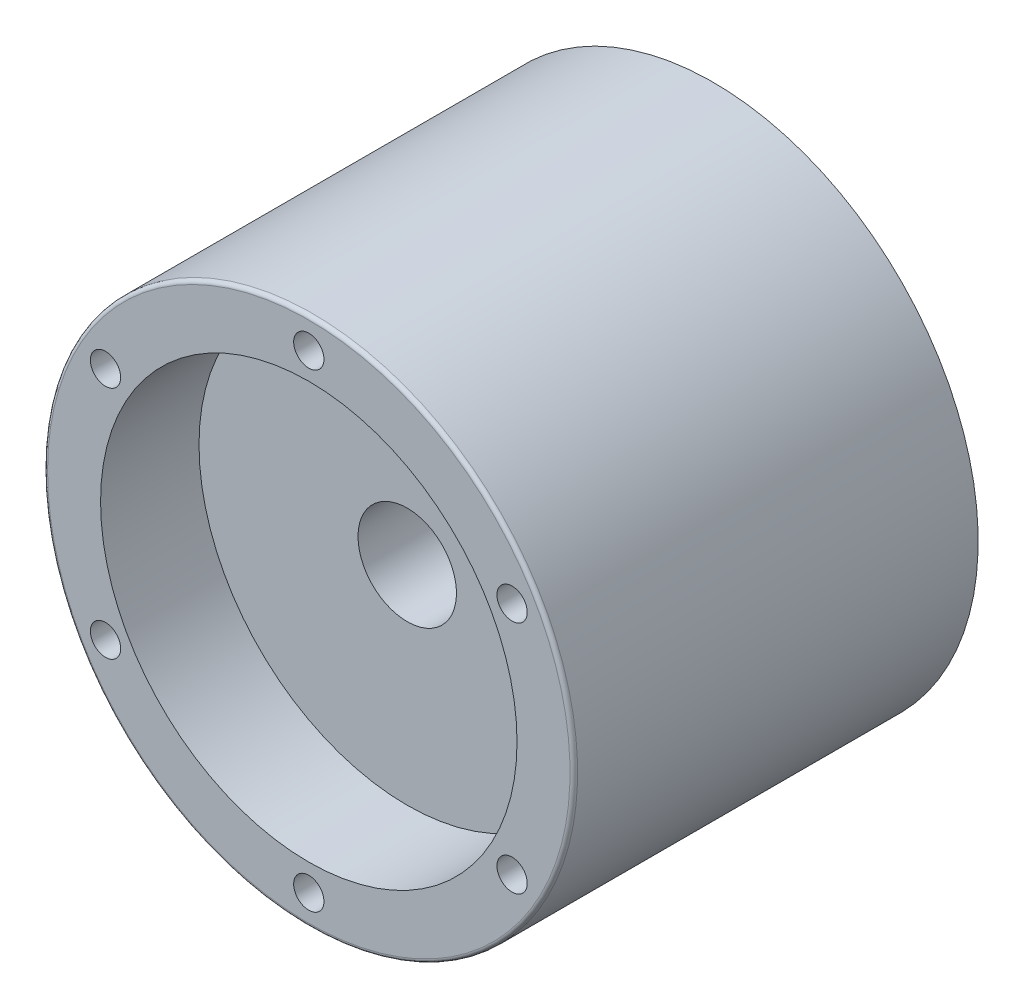
ISO-10303-21;
HEADER;
FILE_DESCRIPTION(('STEP AP214'),'2;1');
FILE_NAME('part.step','',(''),(''),'','','');
FILE_SCHEMA(('AUTOMOTIVE_DESIGN { 1 0 10303 214 1 1 1 1 }'));
ENDSEC;
DATA;
#1=APPLICATION_CONTEXT('core data for automotive mechanical design processes');
#2=APPLICATION_PROTOCOL_DEFINITION('international standard','automotive_design',2000,#1);
#3=PRODUCT_CONTEXT('',#1,'mechanical');
#4=PRODUCT('Part','Part','',(#3));
#5=PRODUCT_RELATED_PRODUCT_CATEGORY('part','',(#4));
#6=PRODUCT_DEFINITION_FORMATION('','',#4);
#7=PRODUCT_DEFINITION_CONTEXT('part definition',#1,'design');
#8=PRODUCT_DEFINITION('design','',#6,#7);
#9=PRODUCT_DEFINITION_SHAPE('','',#8);
#10=(LENGTH_UNIT() NAMED_UNIT(*) SI_UNIT(.MILLI.,.METRE.));
#11=(NAMED_UNIT(*) PLANE_ANGLE_UNIT() SI_UNIT($,.RADIAN.));
#12=(NAMED_UNIT(*) SI_UNIT($,.STERADIAN.) SOLID_ANGLE_UNIT());
#13=UNCERTAINTY_MEASURE_WITH_UNIT(LENGTH_MEASURE(1.E-05),#10,'distance_accuracy_value','');
#14=(GEOMETRIC_REPRESENTATION_CONTEXT(3) GLOBAL_UNCERTAINTY_ASSIGNED_CONTEXT((#13)) GLOBAL_UNIT_ASSIGNED_CONTEXT((#10,
#11,#12)) REPRESENTATION_CONTEXT('',''));
#15=CARTESIAN_POINT('',(0.,0.,0.));
#16=DIRECTION('',(0.,0.,1.));
#17=DIRECTION('',(1.,0.,0.));
#18=AXIS2_PLACEMENT_3D('',#15,#16,#17);
#19=CARTESIAN_POINT('',(0.,0.,0.));
#20=DIRECTION('',(0.,0.,1.));
#21=DIRECTION('',(1.,0.,0.));
#22=AXIS2_PLACEMENT_3D('',#19,#20,#21);
#23=PLANE('',#22);
#24=CARTESIAN_POINT('',(0.,0.,0.));
#25=DIRECTION('',(0.,0.,1.));
#26=DIRECTION('',(1.,0.,0.));
#27=AXIS2_PLACEMENT_3D('',#24,#25,#26);
#28=CIRCLE('',#27,6.5);
#29=CARTESIAN_POINT('',(-6.5,0.,0.));
#30=VERTEX_POINT('',#29);
#31=EDGE_CURVE('E136',#30,#30,#28,.T.);
#32=ORIENTED_EDGE('',*,*,#31,.T.);
#33=EDGE_LOOP('',(#32));
#34=FACE_BOUND('',#33,.T.);
#35=CARTESIAN_POINT('',(0.,0.,0.));
#36=DIRECTION('',(0.,0.,1.));
#37=DIRECTION('',(1.,0.,0.));
#38=AXIS2_PLACEMENT_3D('',#35,#36,#37);
#39=CIRCLE('',#38,35.);
#40=CARTESIAN_POINT('',(-35.,0.,0.));
#41=VERTEX_POINT('',#40);
#42=EDGE_CURVE('E167',#41,#41,#39,.T.);
#43=ORIENTED_EDGE('',*,*,#42,.F.);
#44=EDGE_LOOP('',(#43));
#45=FACE_BOUND('',#44,.T.);
#46=ADVANCED_FACE('F16',(#34,#45),#23,.F.);
#47=CARTESIAN_POINT('',(0.,0.,40.4));
#48=DIRECTION('',(0.,0.,1.));
#49=DIRECTION('',(1.,0.,0.));
#50=AXIS2_PLACEMENT_3D('',#47,#48,#49);
#51=PLANE('',#50);
#52=CARTESIAN_POINT('',(0.,0.,40.4));
#53=DIRECTION('',(0.,0.,-1.));
#54=DIRECTION('',(1.,0.,0.));
#55=AXIS2_PLACEMENT_3D('',#52,#53,#54);
#56=CIRCLE('',#55,6.5);
#57=CARTESIAN_POINT('',(-6.5,0.,40.4));
#58=VERTEX_POINT('',#57);
#59=EDGE_CURVE('E149',#58,#58,#56,.T.);
#60=ORIENTED_EDGE('',*,*,#59,.T.);
#61=EDGE_LOOP('',(#60));
#62=FACE_BOUND('',#61,.T.);
#63=CARTESIAN_POINT('',(0.,0.,40.4));
#64=DIRECTION('',(0.,0.,-1.));
#65=DIRECTION('',(1.,0.,0.));
#66=AXIS2_PLACEMENT_3D('',#63,#64,#65);
#67=CIRCLE('',#66,27.5);
#68=CARTESIAN_POINT('',(-27.5,0.,40.4));
#69=VERTEX_POINT('',#68);
#70=EDGE_CURVE('E11',#69,#69,#67,.T.);
#71=ORIENTED_EDGE('',*,*,#70,.F.);
#72=EDGE_LOOP('',(#71));
#73=FACE_BOUND('',#72,.T.);
#74=ADVANCED_FACE('F259',(#62,#73),#51,.T.);
#75=CARTESIAN_POINT('',(0.,0.,53.4));
#76=DIRECTION('',(0.,0.,-1.));
#77=DIRECTION('',(1.,0.,0.));
#78=AXIS2_PLACEMENT_3D('',#75,#76,#77);
#79=CYLINDRICAL_SURFACE('',#78,27.5);
#80=CARTESIAN_POINT('',(0.,0.,53.4));
#81=DIRECTION('',(0.,0.,-1.));
#82=DIRECTION('',(1.,0.,0.));
#83=AXIS2_PLACEMENT_3D('',#80,#81,#82);
#84=CIRCLE('',#83,27.5);
#85=CARTESIAN_POINT('',(-27.5,0.,53.4));
#86=VERTEX_POINT('',#85);
#87=EDGE_CURVE('E162',#86,#86,#84,.T.);
#88=ORIENTED_EDGE('',*,*,#87,.F.);
#89=DIRECTION('',(0.,0.,-1.));
#90=VECTOR('',#89,1.);
#91=CARTESIAN_POINT('',(-27.5,0.,53.4));
#92=LINE('',#91,#90);
#93=EDGE_CURVE('E27',#86,#69,#92,.T.);
#94=ORIENTED_EDGE('',*,*,#93,.T.);
#95=ORIENTED_EDGE('',*,*,#70,.T.);
#96=ORIENTED_EDGE('',*,*,#93,.F.);
#97=EDGE_LOOP('',(#88,#94,#95,#96));
#98=FACE_BOUND('',#97,.T.);
#99=ADVANCED_FACE('F266',(#98),#79,.F.);
#100=CARTESIAN_POINT('',(0.,31.,33.4));
#101=DIRECTION('',(0.,0.,1.));
#102=DIRECTION('',(1.,0.,0.));
#103=AXIS2_PLACEMENT_3D('',#100,#101,#102);
#104=PLANE('',#103);
#105=CARTESIAN_POINT('',(0.,31.,33.4));
#106=DIRECTION('',(0.,0.,-1.));
#107=DIRECTION('',(1.,0.,0.));
#108=AXIS2_PLACEMENT_3D('',#105,#106,#107);
#109=CIRCLE('',#108,2.);
#110=CARTESIAN_POINT('',(-2.,31.,33.4));
#111=VERTEX_POINT('',#110);
#112=EDGE_CURVE('E182',#111,#111,#109,.T.);
#113=ORIENTED_EDGE('',*,*,#112,.F.);
#114=EDGE_LOOP('',(#113));
#115=FACE_BOUND('',#114,.T.);
#116=ADVANCED_FACE('F280',(#115),#104,.T.);
#117=CARTESIAN_POINT('',(0.,31.,53.4));
#118=DIRECTION('',(0.,0.,-1.));
#119=DIRECTION('',(1.,0.,0.));
#120=AXIS2_PLACEMENT_3D('',#117,#118,#119);
#121=CYLINDRICAL_SURFACE('',#120,2.);
#122=CARTESIAN_POINT('',(0.,31.,53.4));
#123=DIRECTION('',(0.,0.,-1.));
#124=DIRECTION('',(1.,0.,0.));
#125=AXIS2_PLACEMENT_3D('',#122,#123,#124);
#126=CIRCLE('',#125,2.);
#127=CARTESIAN_POINT('',(-2.,31.,53.4));
#128=VERTEX_POINT('',#127);
#129=EDGE_CURVE('E166',#128,#128,#126,.T.);
#130=ORIENTED_EDGE('',*,*,#129,.F.);
#131=DIRECTION('',(0.,0.,-1.));
#132=VECTOR('',#131,1.);
#133=CARTESIAN_POINT('',(-2.,31.,53.4));
#134=LINE('',#133,#132);
#135=EDGE_CURVE('E143',#128,#111,#134,.T.);
#136=ORIENTED_EDGE('',*,*,#135,.T.);
#137=ORIENTED_EDGE('',*,*,#112,.T.);
#138=ORIENTED_EDGE('',*,*,#135,.F.);
#139=EDGE_LOOP('',(#130,#136,#137,#138));
#140=FACE_BOUND('',#139,.T.);
#141=ADVANCED_FACE('F285',(#140),#121,.F.);
#142=CARTESIAN_POINT('',(-26.8467875173176,-15.5,33.4));
#143=DIRECTION('',(0.,0.,1.));
#144=DIRECTION('',(1.,0.,0.));
#145=AXIS2_PLACEMENT_3D('',#142,#143,#144);
#146=PLANE('',#145);
#147=CARTESIAN_POINT('',(-26.8467875173176,-15.5,33.4));
#148=DIRECTION('',(0.,0.,-1.));
#149=DIRECTION('',(1.,0.,0.));
#150=AXIS2_PLACEMENT_3D('',#147,#148,#149);
#151=CIRCLE('',#150,2.);
#152=CARTESIAN_POINT('',(-28.8467875173176,-15.5,33.4));
#153=VERTEX_POINT('',#152);
#154=EDGE_CURVE('E141',#153,#153,#151,.T.);
#155=ORIENTED_EDGE('',*,*,#154,.F.);
#156=EDGE_LOOP('',(#155));
#157=FACE_BOUND('',#156,.T.);
#158=ADVANCED_FACE('F317',(#157),#146,.T.);
#159=CARTESIAN_POINT('',(-26.8467875173176,-15.5,53.4));
#160=DIRECTION('',(0.,0.,-1.));
#161=DIRECTION('',(1.,0.,0.));
#162=AXIS2_PLACEMENT_3D('',#159,#160,#161);
#163=CYLINDRICAL_SURFACE('',#162,2.);
#164=CARTESIAN_POINT('',(-26.8467875173176,-15.5,53.4));
#165=DIRECTION('',(0.,0.,-1.));
#166=DIRECTION('',(1.,0.,0.));
#167=AXIS2_PLACEMENT_3D('',#164,#165,#166);
#168=CIRCLE('',#167,2.);
#169=CARTESIAN_POINT('',(-28.8467875173176,-15.5,53.4));
#170=VERTEX_POINT('',#169);
#171=EDGE_CURVE('E206',#170,#170,#168,.T.);
#172=ORIENTED_EDGE('',*,*,#171,.F.);
#173=DIRECTION('',(0.,0.,-1.));
#174=VECTOR('',#173,1.);
#175=CARTESIAN_POINT('',(-28.8467875173176,-15.5,53.4));
#176=LINE('',#175,#174);
#177=EDGE_CURVE('E139',#170,#153,#176,.T.);
#178=ORIENTED_EDGE('',*,*,#177,.T.);
#179=ORIENTED_EDGE('',*,*,#154,.T.);
#180=ORIENTED_EDGE('',*,*,#177,.F.);
#181=EDGE_LOOP('',(#172,#178,#179,#180));
#182=FACE_BOUND('',#181,.T.);
#183=ADVANCED_FACE('F18',(#182),#163,.F.);
#184=CARTESIAN_POINT('',(0.,-31.,33.4));
#185=DIRECTION('',(0.,0.,1.));
#186=DIRECTION('',(1.,0.,0.));
#187=AXIS2_PLACEMENT_3D('',#184,#185,#186);
#188=PLANE('',#187);
#189=CARTESIAN_POINT('',(0.,-31.,33.4));
#190=DIRECTION('',(0.,0.,-1.));
#191=DIRECTION('',(1.,0.,0.));
#192=AXIS2_PLACEMENT_3D('',#189,#190,#191);
#193=CIRCLE('',#192,2.);
#194=CARTESIAN_POINT('',(-2.,-31.,33.4));
#195=VERTEX_POINT('',#194);
#196=EDGE_CURVE('E214',#195,#195,#193,.T.);
#197=ORIENTED_EDGE('',*,*,#196,.F.);
#198=EDGE_LOOP('',(#197));
#199=FACE_BOUND('',#198,.T.);
#200=ADVANCED_FACE('F254',(#199),#188,.T.);
#201=CARTESIAN_POINT('',(0.,-31.,53.4));
#202=DIRECTION('',(0.,0.,-1.));
#203=DIRECTION('',(1.,0.,0.));
#204=AXIS2_PLACEMENT_3D('',#201,#202,#203);
#205=CYLINDRICAL_SURFACE('',#204,2.);
#206=CARTESIAN_POINT('',(0.,-31.,53.4));
#207=DIRECTION('',(0.,0.,-1.));
#208=DIRECTION('',(1.,0.,0.));
#209=AXIS2_PLACEMENT_3D('',#206,#207,#208);
#210=CIRCLE('',#209,2.);
#211=CARTESIAN_POINT('',(-2.,-31.,53.4));
#212=VERTEX_POINT('',#211);
#213=EDGE_CURVE('E209',#212,#212,#210,.T.);
#214=ORIENTED_EDGE('',*,*,#213,.F.);
#215=DIRECTION('',(0.,0.,-1.));
#216=VECTOR('',#215,1.);
#217=CARTESIAN_POINT('',(-2.,-31.,53.4));
#218=LINE('',#217,#216);
#219=EDGE_CURVE('E210',#212,#195,#218,.T.);
#220=ORIENTED_EDGE('',*,*,#219,.T.);
#221=ORIENTED_EDGE('',*,*,#196,.T.);
#222=ORIENTED_EDGE('',*,*,#219,.F.);
#223=EDGE_LOOP('',(#214,#220,#221,#222));
#224=FACE_BOUND('',#223,.T.);
#225=ADVANCED_FACE('F226',(#224),#205,.F.);
#226=CARTESIAN_POINT('',(26.8467875173176,15.5,33.4));
#227=DIRECTION('',(0.,0.,1.));
#228=DIRECTION('',(1.,0.,0.));
#229=AXIS2_PLACEMENT_3D('',#226,#227,#228);
#230=PLANE('',#229);
#231=CARTESIAN_POINT('',(26.8467875173176,15.5,33.4));
#232=DIRECTION('',(0.,0.,-1.));
#233=DIRECTION('',(1.,0.,0.));
#234=AXIS2_PLACEMENT_3D('',#231,#232,#233);
#235=CIRCLE('',#234,2.);
#236=CARTESIAN_POINT('',(24.8467875173176,15.5,33.4));
#237=VERTEX_POINT('',#236);
#238=EDGE_CURVE('E200',#237,#237,#235,.T.);
#239=ORIENTED_EDGE('',*,*,#238,.F.);
#240=EDGE_LOOP('',(#239));
#241=FACE_BOUND('',#240,.T.);
#242=ADVANCED_FACE('F243',(#241),#230,.T.);
#243=CARTESIAN_POINT('',(26.8467875173176,15.5,53.4));
#244=DIRECTION('',(0.,0.,-1.));
#245=DIRECTION('',(1.,0.,0.));
#246=AXIS2_PLACEMENT_3D('',#243,#244,#245);
#247=CYLINDRICAL_SURFACE('',#246,2.);
#248=CARTESIAN_POINT('',(26.8467875173176,15.5,53.4));
#249=DIRECTION('',(0.,0.,-1.));
#250=DIRECTION('',(1.,0.,0.));
#251=AXIS2_PLACEMENT_3D('',#248,#249,#250);
#252=CIRCLE('',#251,2.);
#253=CARTESIAN_POINT('',(24.8467875173176,15.5,53.4));
#254=VERTEX_POINT('',#253);
#255=EDGE_CURVE('E154',#254,#254,#252,.T.);
#256=ORIENTED_EDGE('',*,*,#255,.F.);
#257=DIRECTION('',(0.,0.,-1.));
#258=VECTOR('',#257,1.);
#259=CARTESIAN_POINT('',(24.8467875173176,15.5,53.4));
#260=LINE('',#259,#258);
#261=EDGE_CURVE('E73',#254,#237,#260,.T.);
#262=ORIENTED_EDGE('',*,*,#261,.T.);
#263=ORIENTED_EDGE('',*,*,#238,.T.);
#264=ORIENTED_EDGE('',*,*,#261,.F.);
#265=EDGE_LOOP('',(#256,#262,#263,#264));
#266=FACE_BOUND('',#265,.T.);
#267=ADVANCED_FACE('F241',(#266),#247,.F.);
#268=CARTESIAN_POINT('',(-26.8467875173176,15.5,33.4));
#269=DIRECTION('',(0.,0.,1.));
#270=DIRECTION('',(1.,0.,0.));
#271=AXIS2_PLACEMENT_3D('',#268,#269,#270);
#272=PLANE('',#271);
#273=CARTESIAN_POINT('',(-26.8467875173176,15.5,33.4));
#274=DIRECTION('',(0.,0.,-1.));
#275=DIRECTION('',(1.,0.,0.));
#276=AXIS2_PLACEMENT_3D('',#273,#274,#275);
#277=CIRCLE('',#276,2.);
#278=CARTESIAN_POINT('',(-28.8467875173176,15.5,33.4));
#279=VERTEX_POINT('',#278);
#280=EDGE_CURVE('E176',#279,#279,#277,.T.);
#281=ORIENTED_EDGE('',*,*,#280,.F.);
#282=EDGE_LOOP('',(#281));
#283=FACE_BOUND('',#282,.T.);
#284=ADVANCED_FACE('F252',(#283),#272,.T.);
#285=CARTESIAN_POINT('',(-26.8467875173176,15.5,53.4));
#286=DIRECTION('',(0.,0.,-1.));
#287=DIRECTION('',(1.,0.,0.));
#288=AXIS2_PLACEMENT_3D('',#285,#286,#287);
#289=CYLINDRICAL_SURFACE('',#288,2.);
#290=CARTESIAN_POINT('',(-26.8467875173176,15.5,53.4));
#291=DIRECTION('',(0.,0.,-1.));
#292=DIRECTION('',(1.,0.,0.));
#293=AXIS2_PLACEMENT_3D('',#290,#291,#292);
#294=CIRCLE('',#293,2.);
#295=CARTESIAN_POINT('',(-28.8467875173176,15.5,53.4));
#296=VERTEX_POINT('',#295);
#297=EDGE_CURVE('E150',#296,#296,#294,.T.);
#298=ORIENTED_EDGE('',*,*,#297,.F.);
#299=DIRECTION('',(0.,0.,-1.));
#300=VECTOR('',#299,1.);
#301=CARTESIAN_POINT('',(-28.8467875173176,15.5,53.4));
#302=LINE('',#301,#300);
#303=EDGE_CURVE('E58',#296,#279,#302,.T.);
#304=ORIENTED_EDGE('',*,*,#303,.T.);
#305=ORIENTED_EDGE('',*,*,#280,.T.);
#306=ORIENTED_EDGE('',*,*,#303,.F.);
#307=EDGE_LOOP('',(#298,#304,#305,#306));
#308=FACE_BOUND('',#307,.T.);
#309=ADVANCED_FACE('F301',(#308),#289,.F.);
#310=CARTESIAN_POINT('',(26.8467875173176,-15.5,33.4));
#311=DIRECTION('',(0.,0.,1.));
#312=DIRECTION('',(1.,0.,0.));
#313=AXIS2_PLACEMENT_3D('',#310,#311,#312);
#314=PLANE('',#313);
#315=CARTESIAN_POINT('',(26.8467875173176,-15.5,33.4));
#316=DIRECTION('',(0.,0.,-1.));
#317=DIRECTION('',(1.,0.,0.));
#318=AXIS2_PLACEMENT_3D('',#315,#316,#317);
#319=CIRCLE('',#318,2.);
#320=CARTESIAN_POINT('',(24.8467875173176,-15.5,33.4));
#321=VERTEX_POINT('',#320);
#322=EDGE_CURVE('E155',#321,#321,#319,.T.);
#323=ORIENTED_EDGE('',*,*,#322,.F.);
#324=EDGE_LOOP('',(#323));
#325=FACE_BOUND('',#324,.T.);
#326=ADVANCED_FACE('F272',(#325),#314,.T.);
#327=CARTESIAN_POINT('',(26.8467875173176,-15.5,53.4));
#328=DIRECTION('',(0.,0.,-1.));
#329=DIRECTION('',(1.,0.,0.));
#330=AXIS2_PLACEMENT_3D('',#327,#328,#329);
#331=CYLINDRICAL_SURFACE('',#330,2.);
#332=CARTESIAN_POINT('',(26.8467875173176,-15.5,53.4));
#333=DIRECTION('',(0.,0.,-1.));
#334=DIRECTION('',(1.,0.,0.));
#335=AXIS2_PLACEMENT_3D('',#332,#333,#334);
#336=CIRCLE('',#335,2.);
#337=CARTESIAN_POINT('',(24.8467875173176,-15.5,53.4));
#338=VERTEX_POINT('',#337);
#339=EDGE_CURVE('E153',#338,#338,#336,.T.);
#340=ORIENTED_EDGE('',*,*,#339,.F.);
#341=DIRECTION('',(0.,0.,-1.));
#342=VECTOR('',#341,1.);
#343=CARTESIAN_POINT('',(24.8467875173176,-15.5,53.4));
#344=LINE('',#343,#342);
#345=EDGE_CURVE('E158',#338,#321,#344,.T.);
#346=ORIENTED_EDGE('',*,*,#345,.T.);
#347=ORIENTED_EDGE('',*,*,#322,.T.);
#348=ORIENTED_EDGE('',*,*,#345,.F.);
#349=EDGE_LOOP('',(#340,#346,#347,#348));
#350=FACE_BOUND('',#349,.T.);
#351=ADVANCED_FACE('F276',(#350),#331,.F.);
#352=CARTESIAN_POINT('',(0.,0.,53.4));
#353=DIRECTION('',(0.,0.,1.));
#354=DIRECTION('',(1.,0.,0.));
#355=AXIS2_PLACEMENT_3D('',#352,#353,#354);
#356=PLANE('',#355);
#357=ORIENTED_EDGE('',*,*,#339,.T.);
#358=EDGE_LOOP('',(#357));
#359=FACE_BOUND('',#358,.T.);
#360=ORIENTED_EDGE('',*,*,#297,.T.);
#361=EDGE_LOOP('',(#360));
#362=FACE_BOUND('',#361,.T.);
#363=ORIENTED_EDGE('',*,*,#255,.T.);
#364=EDGE_LOOP('',(#363));
#365=FACE_BOUND('',#364,.T.);
#366=ORIENTED_EDGE('',*,*,#213,.T.);
#367=EDGE_LOOP('',(#366));
#368=FACE_BOUND('',#367,.T.);
#369=ORIENTED_EDGE('',*,*,#171,.T.);
#370=EDGE_LOOP('',(#369));
#371=FACE_BOUND('',#370,.T.);
#372=ORIENTED_EDGE('',*,*,#129,.T.);
#373=EDGE_LOOP('',(#372));
#374=FACE_BOUND('',#373,.T.);
#375=ORIENTED_EDGE('',*,*,#87,.T.);
#376=EDGE_LOOP('',(#375));
#377=FACE_BOUND('',#376,.T.);
#378=CARTESIAN_POINT('',(0.,0.,53.4));
#379=DIRECTION('',(0.,0.,-1.));
#380=DIRECTION('',(-1.,0.,0.));
#381=AXIS2_PLACEMENT_3D('',#378,#379,#380);
#382=CIRCLE('',#381,34.5);
#383=CARTESIAN_POINT('',(-34.5,0.,53.4));
#384=VERTEX_POINT('',#383);
#385=EDGE_CURVE('E20',#384,#384,#382,.T.);
#386=ORIENTED_EDGE('',*,*,#385,.F.);
#387=EDGE_LOOP('',(#386));
#388=FACE_BOUND('',#387,.T.);
#389=ADVANCED_FACE('F223',(#359,#362,#365,#368,#371,#374,#377,#388),#356,.T.);
#390=CARTESIAN_POINT('',(0.,0.,0.));
#391=DIRECTION('',(0.,0.,1.));
#392=DIRECTION('',(1.,0.,0.));
#393=AXIS2_PLACEMENT_3D('',#390,#391,#392);
#394=CYLINDRICAL_SURFACE('',#393,35.);
#395=CARTESIAN_POINT('',(0.,0.,52.9));
#396=DIRECTION('',(0.,0.,1.));
#397=DIRECTION('',(-1.,0.,0.));
#398=AXIS2_PLACEMENT_3D('',#395,#396,#397);
#399=CIRCLE('',#398,35.);
#400=CARTESIAN_POINT('',(-35.,0.,52.9));
#401=VERTEX_POINT('',#400);
#402=EDGE_CURVE('E126',#401,#401,#399,.T.);
#403=ORIENTED_EDGE('',*,*,#402,.F.);
#404=DIRECTION('',(0.,0.,-1.));
#405=VECTOR('',#404,1.);
#406=CARTESIAN_POINT('',(-35.,0.,0.));
#407=LINE('',#406,#405);
#408=EDGE_CURVE('E134',#401,#41,#407,.T.);
#409=ORIENTED_EDGE('',*,*,#408,.T.);
#410=ORIENTED_EDGE('',*,*,#42,.T.);
#411=ORIENTED_EDGE('',*,*,#408,.F.);
#412=EDGE_LOOP('',(#403,#409,#410,#411));
#413=FACE_BOUND('',#412,.T.);
#414=ADVANCED_FACE('F291',(#413),#394,.T.);
#415=CARTESIAN_POINT('',(0.,0.,52.9));
#416=DIRECTION('',(0.,0.,1.));
#417=DIRECTION('',(1.,0.,0.));
#418=AXIS2_PLACEMENT_3D('',#415,#416,#417);
#419=TOROIDAL_SURFACE('',#418,34.5,0.5);
#420=ORIENTED_EDGE('',*,*,#385,.T.);
#421=CARTESIAN_POINT('',(-34.5,0.,52.9));
#422=DIRECTION('',(0.,-1.,0.));
#423=DIRECTION('',(-1.,0.,0.));
#424=AXIS2_PLACEMENT_3D('',#421,#422,#423);
#425=CIRCLE('',#424,0.5);
#426=EDGE_CURVE('E122',#384,#401,#425,.T.);
#427=ORIENTED_EDGE('',*,*,#426,.T.);
#428=ORIENTED_EDGE('',*,*,#402,.T.);
#429=ORIENTED_EDGE('',*,*,#426,.F.);
#430=EDGE_LOOP('',(#420,#427,#428,#429));
#431=FACE_BOUND('',#430,.T.);
#432=ADVANCED_FACE('F123',(#431),#419,.T.);
#433=CARTESIAN_POINT('',(0.,0.,40.4));
#434=DIRECTION('',(0.,0.,-1.));
#435=DIRECTION('',(1.,0.,0.));
#436=AXIS2_PLACEMENT_3D('',#433,#434,#435);
#437=CYLINDRICAL_SURFACE('',#436,6.5);
#438=ORIENTED_EDGE('',*,*,#59,.F.);
#439=DIRECTION('',(0.,0.,-1.));
#440=VECTOR('',#439,1.);
#441=CARTESIAN_POINT('',(-6.5,0.,40.4));
#442=LINE('',#441,#440);
#443=EDGE_CURVE('E145',#58,#30,#442,.T.);
#444=ORIENTED_EDGE('',*,*,#443,.T.);
#445=ORIENTED_EDGE('',*,*,#31,.F.);
#446=ORIENTED_EDGE('',*,*,#443,.F.);
#447=EDGE_LOOP('',(#438,#444,#445,#446));
#448=FACE_BOUND('',#447,.T.);
#449=ADVANCED_FACE('F320',(#448),#437,.F.);
#450=CLOSED_SHELL('',(#46,#74,#99,#116,#141,#158,#183,#200,#225,#242,#267,#284,#309,#326,#351,
#389,#414,#432,#449));
#451=MANIFOLD_SOLID_BREP('B1',#450);
#452=ADVANCED_BREP_SHAPE_REPRESENTATION('',(#18,#451),#14);
#453=SHAPE_DEFINITION_REPRESENTATION(#9,#452);
ENDSEC;
END-ISO-10303-21;
